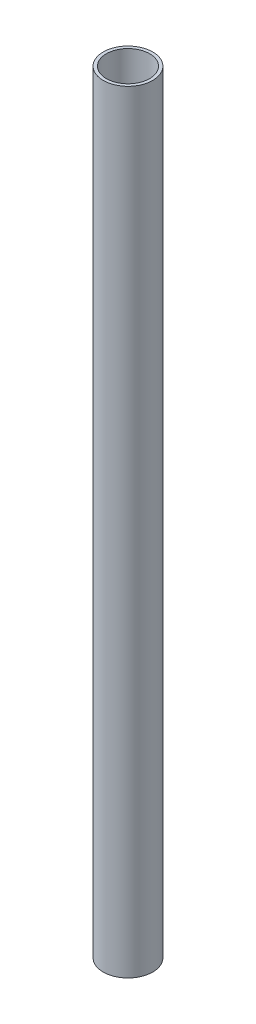
ISO-10303-21;
HEADER;
FILE_DESCRIPTION(('STEP AP214'),'2;1');
FILE_NAME('part.step','',(''),(''),'','','');
FILE_SCHEMA(('AUTOMOTIVE_DESIGN { 1 0 10303 214 1 1 1 1 }'));
ENDSEC;
DATA;
#1=APPLICATION_CONTEXT('core data for automotive mechanical design processes');
#2=APPLICATION_PROTOCOL_DEFINITION('international standard','automotive_design',2000,#1);
#3=PRODUCT_CONTEXT('',#1,'mechanical');
#4=PRODUCT('Part','Part','',(#3));
#5=PRODUCT_RELATED_PRODUCT_CATEGORY('part','',(#4));
#6=PRODUCT_DEFINITION_FORMATION('','',#4);
#7=PRODUCT_DEFINITION_CONTEXT('part definition',#1,'design');
#8=PRODUCT_DEFINITION('design','',#6,#7);
#9=PRODUCT_DEFINITION_SHAPE('','',#8);
#10=(LENGTH_UNIT() NAMED_UNIT(*) SI_UNIT(.MILLI.,.METRE.));
#11=(NAMED_UNIT(*) PLANE_ANGLE_UNIT() SI_UNIT($,.RADIAN.));
#12=(NAMED_UNIT(*) SI_UNIT($,.STERADIAN.) SOLID_ANGLE_UNIT());
#13=UNCERTAINTY_MEASURE_WITH_UNIT(LENGTH_MEASURE(1.E-05),#10,'distance_accuracy_value','');
#14=(GEOMETRIC_REPRESENTATION_CONTEXT(3) GLOBAL_UNCERTAINTY_ASSIGNED_CONTEXT((#13)) GLOBAL_UNIT_ASSIGNED_CONTEXT((#10,
#11,#12)) REPRESENTATION_CONTEXT('',''));
#15=CARTESIAN_POINT('',(0.,0.,0.));
#16=DIRECTION('',(0.,0.,1.));
#17=DIRECTION('',(1.,0.,0.));
#18=AXIS2_PLACEMENT_3D('',#15,#16,#17);
#19=CARTESIAN_POINT('',(0.,250.,0.));
#20=DIRECTION('',(0.,1.,0.));
#21=DIRECTION('',(0.,0.,1.));
#22=AXIS2_PLACEMENT_3D('',#19,#20,#21);
#23=PLANE('',#22);
#24=CARTESIAN_POINT('',(0.,250.,0.));
#25=DIRECTION('',(0.,1.,0.));
#26=DIRECTION('',(0.,0.,1.));
#27=AXIS2_PLACEMENT_3D('',#24,#25,#26);
#28=CIRCLE('',#27,8.);
#29=CARTESIAN_POINT('',(0.,250.,8.));
#30=VERTEX_POINT('',#29);
#31=EDGE_CURVE('E10',#30,#30,#28,.T.);
#32=ORIENTED_EDGE('',*,*,#31,.T.);
#33=EDGE_LOOP('',(#32));
#34=FACE_BOUND('',#33,.T.);
#35=CARTESIAN_POINT('',(0.,250.,0.));
#36=DIRECTION('',(0.,1.,0.));
#37=DIRECTION('',(0.,0.,1.));
#38=AXIS2_PLACEMENT_3D('',#35,#36,#37);
#39=CIRCLE('',#38,7.);
#40=CARTESIAN_POINT('',(0.,250.,7.));
#41=VERTEX_POINT('',#40);
#42=EDGE_CURVE('E48',#41,#41,#39,.T.);
#43=ORIENTED_EDGE('',*,*,#42,.F.);
#44=EDGE_LOOP('',(#43));
#45=FACE_BOUND('',#44,.T.);
#46=ADVANCED_FACE('F40',(#34,#45),#23,.T.);
#47=CARTESIAN_POINT('',(0.,0.,0.));
#48=DIRECTION('',(0.,1.,0.));
#49=DIRECTION('',(0.,0.,1.));
#50=AXIS2_PLACEMENT_3D('',#47,#48,#49);
#51=PLANE('',#50);
#52=CARTESIAN_POINT('',(0.,0.,0.));
#53=DIRECTION('',(0.,1.,0.));
#54=DIRECTION('',(0.,0.,1.));
#55=AXIS2_PLACEMENT_3D('',#52,#53,#54);
#56=CIRCLE('',#55,8.);
#57=CARTESIAN_POINT('',(0.,0.,8.));
#58=VERTEX_POINT('',#57);
#59=EDGE_CURVE('E41',#58,#58,#56,.T.);
#60=ORIENTED_EDGE('',*,*,#59,.F.);
#61=EDGE_LOOP('',(#60));
#62=FACE_BOUND('',#61,.T.);
#63=CARTESIAN_POINT('',(0.,0.,0.));
#64=DIRECTION('',(0.,1.,0.));
#65=DIRECTION('',(0.,0.,1.));
#66=AXIS2_PLACEMENT_3D('',#63,#64,#65);
#67=CIRCLE('',#66,7.);
#68=CARTESIAN_POINT('',(0.,0.,7.));
#69=VERTEX_POINT('',#68);
#70=EDGE_CURVE('E49',#69,#69,#67,.T.);
#71=ORIENTED_EDGE('',*,*,#70,.T.);
#72=EDGE_LOOP('',(#71));
#73=FACE_BOUND('',#72,.T.);
#74=ADVANCED_FACE('F58',(#62,#73),#51,.F.);
#75=CARTESIAN_POINT('',(0.,250.,0.));
#76=DIRECTION('',(0.,-1.,0.));
#77=DIRECTION('',(0.,0.,-1.));
#78=AXIS2_PLACEMENT_3D('',#75,#76,#77);
#79=CYLINDRICAL_SURFACE('',#78,8.);
#80=ORIENTED_EDGE('',*,*,#31,.F.);
#81=EDGE_LOOP('',(#80));
#82=FACE_BOUND('',#81,.T.);
#83=ORIENTED_EDGE('',*,*,#59,.T.);
#84=EDGE_LOOP('',(#83));
#85=FACE_BOUND('',#84,.T.);
#86=ADVANCED_FACE('F39',(#82,#85),#79,.T.);
#87=CARTESIAN_POINT('',(0.,250.,0.));
#88=DIRECTION('',(0.,-1.,0.));
#89=DIRECTION('',(0.,0.,-1.));
#90=AXIS2_PLACEMENT_3D('',#87,#88,#89);
#91=CYLINDRICAL_SURFACE('',#90,7.);
#92=ORIENTED_EDGE('',*,*,#42,.T.);
#93=EDGE_LOOP('',(#92));
#94=FACE_BOUND('',#93,.T.);
#95=ORIENTED_EDGE('',*,*,#70,.F.);
#96=EDGE_LOOP('',(#95));
#97=FACE_BOUND('',#96,.T.);
#98=ADVANCED_FACE('F57',(#94,#97),#91,.F.);
#99=CLOSED_SHELL('',(#46,#74,#86,#98));
#100=MANIFOLD_SOLID_BREP('B2',#99);
#101=ADVANCED_BREP_SHAPE_REPRESENTATION('',(#18,#100),#14);
#102=SHAPE_DEFINITION_REPRESENTATION(#9,#101);
ENDSEC;
END-ISO-10303-21;
